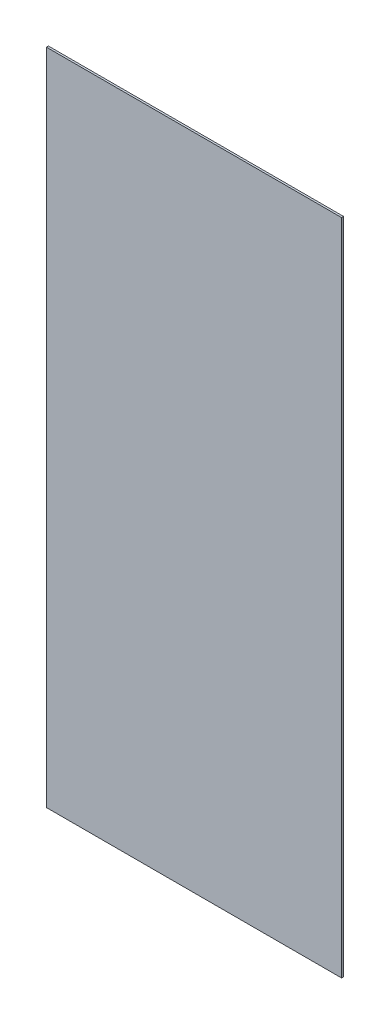
ISO-10303-21;
HEADER;
FILE_DESCRIPTION(('STEP AP214'),'2;1');
FILE_NAME('part.step','',(''),(''),'','','');
FILE_SCHEMA(('AUTOMOTIVE_DESIGN { 1 0 10303 214 1 1 1 1 }'));
ENDSEC;
DATA;
#1=APPLICATION_CONTEXT('core data for automotive mechanical design processes');
#2=APPLICATION_PROTOCOL_DEFINITION('international standard','automotive_design',2000,#1);
#3=PRODUCT_CONTEXT('',#1,'mechanical');
#4=PRODUCT('Part','Part','',(#3));
#5=PRODUCT_RELATED_PRODUCT_CATEGORY('part','',(#4));
#6=PRODUCT_DEFINITION_FORMATION('','',#4);
#7=PRODUCT_DEFINITION_CONTEXT('part definition',#1,'design');
#8=PRODUCT_DEFINITION('design','',#6,#7);
#9=PRODUCT_DEFINITION_SHAPE('','',#8);
#10=(LENGTH_UNIT() NAMED_UNIT(*) SI_UNIT(.MILLI.,.METRE.));
#11=(NAMED_UNIT(*) PLANE_ANGLE_UNIT() SI_UNIT($,.RADIAN.));
#12=(NAMED_UNIT(*) SI_UNIT($,.STERADIAN.) SOLID_ANGLE_UNIT());
#13=UNCERTAINTY_MEASURE_WITH_UNIT(LENGTH_MEASURE(1.E-05),#10,'distance_accuracy_value','');
#14=(GEOMETRIC_REPRESENTATION_CONTEXT(3) GLOBAL_UNCERTAINTY_ASSIGNED_CONTEXT((#13)) GLOBAL_UNIT_ASSIGNED_CONTEXT((#10,
#11,#12)) REPRESENTATION_CONTEXT('',''));
#15=CARTESIAN_POINT('',(0.,0.,0.));
#16=DIRECTION('',(0.,0.,1.));
#17=DIRECTION('',(1.,0.,0.));
#18=AXIS2_PLACEMENT_3D('',#15,#16,#17);
#19=CARTESIAN_POINT('',(-37.25,-83.1,0.25));
#20=DIRECTION('',(1.,0.,0.));
#21=DIRECTION('',(0.,0.,-1.));
#22=AXIS2_PLACEMENT_3D('',#19,#20,#21);
#23=PLANE('',#22);
#24=DIRECTION('',(0.,-1.,0.));
#25=VECTOR('',#24,1.);
#26=CARTESIAN_POINT('',(-37.25,-83.1,-0.25));
#27=LINE('',#26,#25);
#28=CARTESIAN_POINT('',(-37.25,83.1,-0.25));
#29=VERTEX_POINT('',#28);
#30=CARTESIAN_POINT('',(-37.25,-83.1,-0.25));
#31=VERTEX_POINT('',#30);
#32=EDGE_CURVE('E97',#29,#31,#27,.T.);
#33=ORIENTED_EDGE('',*,*,#32,.T.);
#34=DIRECTION('',(0.,0.,-1.));
#35=VECTOR('',#34,1.);
#36=CARTESIAN_POINT('',(-37.25,-83.1,0.25));
#37=LINE('',#36,#35);
#38=CARTESIAN_POINT('',(-37.25,-83.1,0.25));
#39=VERTEX_POINT('',#38);
#40=EDGE_CURVE('E11',#39,#31,#37,.T.);
#41=ORIENTED_EDGE('',*,*,#40,.F.);
#42=DIRECTION('',(0.,-1.,0.));
#43=VECTOR('',#42,1.);
#44=CARTESIAN_POINT('',(-37.25,-83.1,0.25));
#45=LINE('',#44,#43);
#46=CARTESIAN_POINT('',(-37.25,83.1,0.25));
#47=VERTEX_POINT('',#46);
#48=EDGE_CURVE('E85',#47,#39,#45,.T.);
#49=ORIENTED_EDGE('',*,*,#48,.F.);
#50=DIRECTION('',(0.,0.,-1.));
#51=VECTOR('',#50,1.);
#52=CARTESIAN_POINT('',(-37.25,83.1,0.25));
#53=LINE('',#52,#51);
#54=EDGE_CURVE('E93',#47,#29,#53,.T.);
#55=ORIENTED_EDGE('',*,*,#54,.T.);
#56=EDGE_LOOP('',(#33,#41,#49,#55));
#57=FACE_BOUND('',#56,.T.);
#58=ADVANCED_FACE('F34',(#57),#23,.F.);
#59=CARTESIAN_POINT('',(37.25,-83.1,0.25));
#60=DIRECTION('',(0.,1.,0.));
#61=DIRECTION('',(0.,0.,1.));
#62=AXIS2_PLACEMENT_3D('',#59,#60,#61);
#63=PLANE('',#62);
#64=DIRECTION('',(1.,0.,0.));
#65=VECTOR('',#64,1.);
#66=CARTESIAN_POINT('',(37.25,-83.1,-0.25));
#67=LINE('',#66,#65);
#68=CARTESIAN_POINT('',(37.25,-83.1,-0.25));
#69=VERTEX_POINT('',#68);
#70=EDGE_CURVE('E89',#31,#69,#67,.T.);
#71=ORIENTED_EDGE('',*,*,#70,.T.);
#72=DIRECTION('',(0.,0.,-1.));
#73=VECTOR('',#72,1.);
#74=CARTESIAN_POINT('',(37.25,-83.1,0.25));
#75=LINE('',#74,#73);
#76=CARTESIAN_POINT('',(37.25,-83.1,0.25));
#77=VERTEX_POINT('',#76);
#78=EDGE_CURVE('E42',#77,#69,#75,.T.);
#79=ORIENTED_EDGE('',*,*,#78,.F.);
#80=DIRECTION('',(1.,0.,0.));
#81=VECTOR('',#80,1.);
#82=CARTESIAN_POINT('',(37.25,-83.1,0.25));
#83=LINE('',#82,#81);
#84=EDGE_CURVE('E80',#39,#77,#83,.T.);
#85=ORIENTED_EDGE('',*,*,#84,.F.);
#86=ORIENTED_EDGE('',*,*,#40,.T.);
#87=EDGE_LOOP('',(#71,#79,#85,#86));
#88=FACE_BOUND('',#87,.T.);
#89=ADVANCED_FACE('F88',(#88),#63,.F.);
#90=CARTESIAN_POINT('',(37.25,-83.1,0.25));
#91=DIRECTION('',(-1.,0.,0.));
#92=DIRECTION('',(0.,0.,1.));
#93=AXIS2_PLACEMENT_3D('',#90,#91,#92);
#94=PLANE('',#93);
#95=DIRECTION('',(0.,1.,0.));
#96=VECTOR('',#95,1.);
#97=CARTESIAN_POINT('',(37.25,-83.1,-0.25));
#98=LINE('',#97,#96);
#99=CARTESIAN_POINT('',(37.25,83.1,-0.25));
#100=VERTEX_POINT('',#99);
#101=EDGE_CURVE('E67',#69,#100,#98,.T.);
#102=ORIENTED_EDGE('',*,*,#101,.T.);
#103=DIRECTION('',(0.,0.,-1.));
#104=VECTOR('',#103,1.);
#105=CARTESIAN_POINT('',(37.25,83.1,0.25));
#106=LINE('',#105,#104);
#107=CARTESIAN_POINT('',(37.25,83.1,0.25));
#108=VERTEX_POINT('',#107);
#109=EDGE_CURVE('E90',#108,#100,#106,.T.);
#110=ORIENTED_EDGE('',*,*,#109,.F.);
#111=DIRECTION('',(0.,1.,0.));
#112=VECTOR('',#111,1.);
#113=CARTESIAN_POINT('',(37.25,-83.1,0.25));
#114=LINE('',#113,#112);
#115=EDGE_CURVE('E83',#77,#108,#114,.T.);
#116=ORIENTED_EDGE('',*,*,#115,.F.);
#117=ORIENTED_EDGE('',*,*,#78,.T.);
#118=EDGE_LOOP('',(#102,#110,#116,#117));
#119=FACE_BOUND('',#118,.T.);
#120=ADVANCED_FACE('F91',(#119),#94,.F.);
#121=CARTESIAN_POINT('',(37.25,83.1,0.25));
#122=DIRECTION('',(0.,-1.,0.));
#123=DIRECTION('',(1.,0.,0.));
#124=AXIS2_PLACEMENT_3D('',#121,#122,#123);
#125=PLANE('',#124);
#126=DIRECTION('',(-1.,0.,0.));
#127=VECTOR('',#126,1.);
#128=CARTESIAN_POINT('',(37.25,83.1,-0.25));
#129=LINE('',#128,#127);
#130=EDGE_CURVE('E73',#100,#29,#129,.T.);
#131=ORIENTED_EDGE('',*,*,#130,.T.);
#132=ORIENTED_EDGE('',*,*,#54,.F.);
#133=DIRECTION('',(-1.,0.,0.));
#134=VECTOR('',#133,1.);
#135=CARTESIAN_POINT('',(37.25,83.1,0.25));
#136=LINE('',#135,#134);
#137=EDGE_CURVE('E50',#108,#47,#136,.T.);
#138=ORIENTED_EDGE('',*,*,#137,.F.);
#139=ORIENTED_EDGE('',*,*,#109,.T.);
#140=EDGE_LOOP('',(#131,#132,#138,#139));
#141=FACE_BOUND('',#140,.T.);
#142=ADVANCED_FACE('F104',(#141),#125,.F.);
#143=CARTESIAN_POINT('',(0.,0.,0.25));
#144=DIRECTION('',(0.,0.,1.));
#145=DIRECTION('',(1.,0.,0.));
#146=AXIS2_PLACEMENT_3D('',#143,#144,#145);
#147=PLANE('',#146);
#148=ORIENTED_EDGE('',*,*,#48,.T.);
#149=ORIENTED_EDGE('',*,*,#84,.T.);
#150=ORIENTED_EDGE('',*,*,#115,.T.);
#151=ORIENTED_EDGE('',*,*,#137,.T.);
#152=EDGE_LOOP('',(#148,#149,#150,#151));
#153=FACE_BOUND('',#152,.T.);
#154=ADVANCED_FACE('F81',(#153),#147,.T.);
#155=CARTESIAN_POINT('',(0.,0.,-0.25));
#156=DIRECTION('',(0.,0.,1.));
#157=DIRECTION('',(1.,0.,0.));
#158=AXIS2_PLACEMENT_3D('',#155,#156,#157);
#159=PLANE('',#158);
#160=ORIENTED_EDGE('',*,*,#32,.F.);
#161=ORIENTED_EDGE('',*,*,#130,.F.);
#162=ORIENTED_EDGE('',*,*,#101,.F.);
#163=ORIENTED_EDGE('',*,*,#70,.F.);
#164=EDGE_LOOP('',(#160,#161,#162,#163));
#165=FACE_BOUND('',#164,.T.);
#166=ADVANCED_FACE('F107',(#165),#159,.F.);
#167=CLOSED_SHELL('',(#58,#89,#120,#142,#154,#166));
#168=MANIFOLD_SOLID_BREP('B2',#167);
#169=ADVANCED_BREP_SHAPE_REPRESENTATION('',(#18,#168),#14);
#170=SHAPE_DEFINITION_REPRESENTATION(#9,#169);
ENDSEC;
END-ISO-10303-21;
